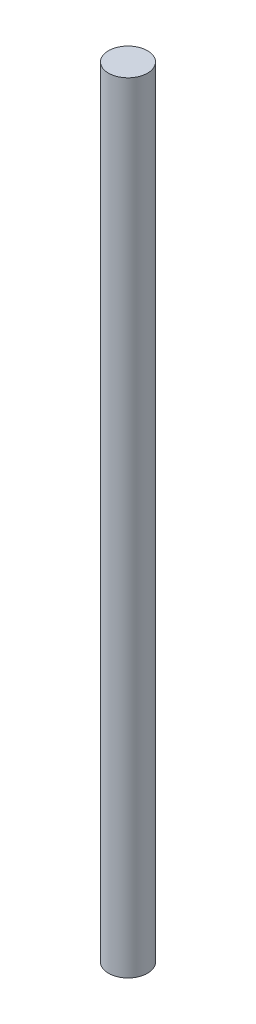
ISO-10303-21;
HEADER;
FILE_DESCRIPTION(('STEP AP214'),'2;1');
FILE_NAME('part.step','',(''),(''),'','','');
FILE_SCHEMA(('AUTOMOTIVE_DESIGN { 1 0 10303 214 1 1 1 1 }'));
ENDSEC;
DATA;
#1=APPLICATION_CONTEXT('core data for automotive mechanical design processes');
#2=APPLICATION_PROTOCOL_DEFINITION('international standard','automotive_design',2000,#1);
#3=PRODUCT_CONTEXT('',#1,'mechanical');
#4=PRODUCT('Part','Part','',(#3));
#5=PRODUCT_RELATED_PRODUCT_CATEGORY('part','',(#4));
#6=PRODUCT_DEFINITION_FORMATION('','',#4);
#7=PRODUCT_DEFINITION_CONTEXT('part definition',#1,'design');
#8=PRODUCT_DEFINITION('design','',#6,#7);
#9=PRODUCT_DEFINITION_SHAPE('','',#8);
#10=(LENGTH_UNIT() NAMED_UNIT(*) SI_UNIT(.MILLI.,.METRE.));
#11=(NAMED_UNIT(*) PLANE_ANGLE_UNIT() SI_UNIT($,.RADIAN.));
#12=(NAMED_UNIT(*) SI_UNIT($,.STERADIAN.) SOLID_ANGLE_UNIT());
#13=UNCERTAINTY_MEASURE_WITH_UNIT(LENGTH_MEASURE(1.E-05),#10,'distance_accuracy_value','');
#14=(GEOMETRIC_REPRESENTATION_CONTEXT(3) GLOBAL_UNCERTAINTY_ASSIGNED_CONTEXT((#13)) GLOBAL_UNIT_ASSIGNED_CONTEXT((#10,
#11,#12)) REPRESENTATION_CONTEXT('',''));
#15=CARTESIAN_POINT('',(0.,0.,0.));
#16=DIRECTION('',(0.,0.,1.));
#17=DIRECTION('',(1.,0.,0.));
#18=AXIS2_PLACEMENT_3D('',#15,#16,#17);
#19=CARTESIAN_POINT('',(0.,80.,0.));
#20=DIRECTION('',(0.,-1.,0.));
#21=DIRECTION('',(0.,0.,-1.));
#22=AXIS2_PLACEMENT_3D('',#19,#20,#21);
#23=CYLINDRICAL_SURFACE('',#22,2.);
#24=CARTESIAN_POINT('',(0.,80.,0.));
#25=DIRECTION('',(0.,1.,0.));
#26=DIRECTION('',(0.,0.,1.));
#27=AXIS2_PLACEMENT_3D('',#24,#25,#26);
#28=CIRCLE('',#27,2.);
#29=CARTESIAN_POINT('',(0.,80.,2.));
#30=VERTEX_POINT('',#29);
#31=EDGE_CURVE('E10',#30,#30,#28,.T.);
#32=ORIENTED_EDGE('',*,*,#31,.F.);
#33=EDGE_LOOP('',(#32));
#34=FACE_BOUND('',#33,.T.);
#35=CARTESIAN_POINT('',(0.,0.,0.));
#36=DIRECTION('',(0.,1.,0.));
#37=DIRECTION('',(0.,0.,1.));
#38=AXIS2_PLACEMENT_3D('',#35,#36,#37);
#39=CIRCLE('',#38,2.);
#40=CARTESIAN_POINT('',(0.,0.,2.));
#41=VERTEX_POINT('',#40);
#42=EDGE_CURVE('E34',#41,#41,#39,.T.);
#43=ORIENTED_EDGE('',*,*,#42,.T.);
#44=EDGE_LOOP('',(#43));
#45=FACE_BOUND('',#44,.T.);
#46=ADVANCED_FACE('F31',(#34,#45),#23,.T.);
#47=CARTESIAN_POINT('',(0.,80.,0.));
#48=DIRECTION('',(0.,1.,0.));
#49=DIRECTION('',(0.,0.,1.));
#50=AXIS2_PLACEMENT_3D('',#47,#48,#49);
#51=PLANE('',#50);
#52=ORIENTED_EDGE('',*,*,#31,.T.);
#53=EDGE_LOOP('',(#52));
#54=FACE_BOUND('',#53,.T.);
#55=ADVANCED_FACE('F46',(#54),#51,.T.);
#56=CARTESIAN_POINT('',(0.,0.,0.));
#57=DIRECTION('',(0.,1.,0.));
#58=DIRECTION('',(0.,0.,1.));
#59=AXIS2_PLACEMENT_3D('',#56,#57,#58);
#60=PLANE('',#59);
#61=ORIENTED_EDGE('',*,*,#42,.F.);
#62=EDGE_LOOP('',(#61));
#63=FACE_BOUND('',#62,.T.);
#64=ADVANCED_FACE('F44',(#63),#60,.F.);
#65=CLOSED_SHELL('',(#46,#55,#64));
#66=MANIFOLD_SOLID_BREP('B2',#65);
#67=ADVANCED_BREP_SHAPE_REPRESENTATION('',(#18,#66),#14);
#68=SHAPE_DEFINITION_REPRESENTATION(#9,#67);
ENDSEC;
END-ISO-10303-21;
